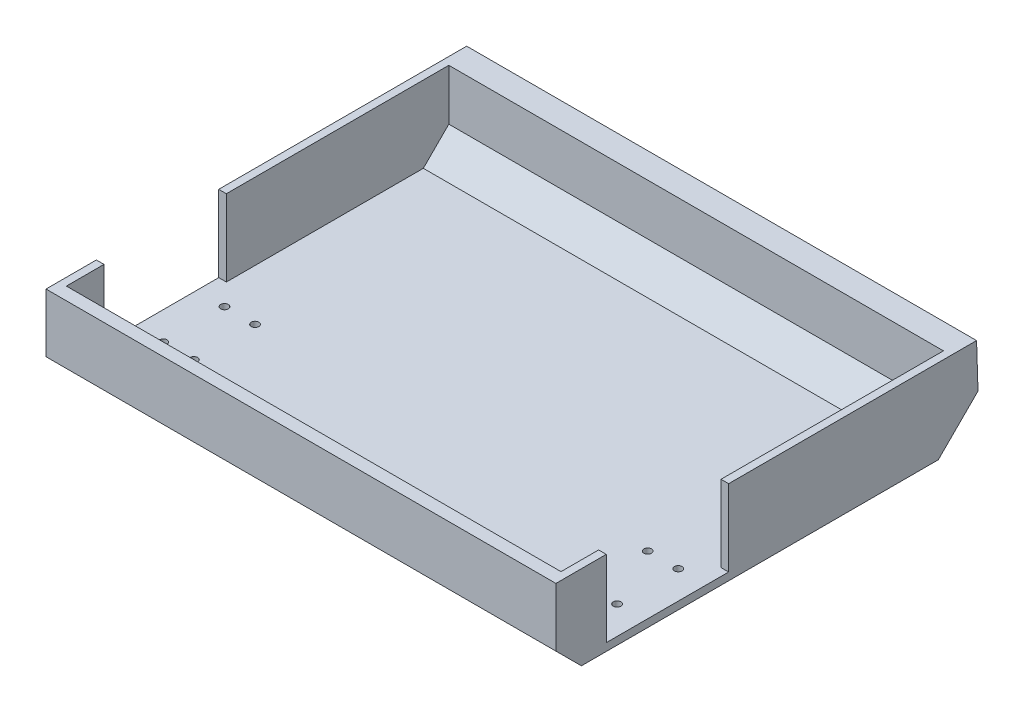
ISO-10303-21;
HEADER;
FILE_DESCRIPTION(('STEP AP214'),'2;1');
FILE_NAME('part.step','',(''),(''),'','','');
FILE_SCHEMA(('AUTOMOTIVE_DESIGN { 1 0 10303 214 1 1 1 1 }'));
ENDSEC;
DATA;
#1=APPLICATION_CONTEXT('core data for automotive mechanical design processes');
#2=APPLICATION_PROTOCOL_DEFINITION('international standard','automotive_design',2000,#1);
#3=PRODUCT_CONTEXT('',#1,'mechanical');
#4=PRODUCT('Part','Part','',(#3));
#5=PRODUCT_RELATED_PRODUCT_CATEGORY('part','',(#4));
#6=PRODUCT_DEFINITION_FORMATION('','',#4);
#7=PRODUCT_DEFINITION_CONTEXT('part definition',#1,'design');
#8=PRODUCT_DEFINITION('design','',#6,#7);
#9=PRODUCT_DEFINITION_SHAPE('','',#8);
#10=(LENGTH_UNIT() NAMED_UNIT(*) SI_UNIT(.MILLI.,.METRE.));
#11=(NAMED_UNIT(*) PLANE_ANGLE_UNIT() SI_UNIT($,.RADIAN.));
#12=(NAMED_UNIT(*) SI_UNIT($,.STERADIAN.) SOLID_ANGLE_UNIT());
#13=UNCERTAINTY_MEASURE_WITH_UNIT(LENGTH_MEASURE(1.E-05),#10,'distance_accuracy_value','');
#14=(GEOMETRIC_REPRESENTATION_CONTEXT(3) GLOBAL_UNCERTAINTY_ASSIGNED_CONTEXT((#13)) GLOBAL_UNIT_ASSIGNED_CONTEXT((#10,
#11,#12)) REPRESENTATION_CONTEXT('',''));
#15=CARTESIAN_POINT('',(0.,0.,0.));
#16=DIRECTION('',(0.,0.,1.));
#17=DIRECTION('',(1.,0.,0.));
#18=AXIS2_PLACEMENT_3D('',#15,#16,#17);
#19=CARTESIAN_POINT('',(2.99999999999999,33.,-150.));
#20=DIRECTION('',(-1.,0.,0.));
#21=DIRECTION('',(0.,0.,1.));
#22=AXIS2_PLACEMENT_3D('',#19,#20,#21);
#23=PLANE('',#22);
#24=DIRECTION('',(0.,0.,-1.));
#25=VECTOR('',#24,1.);
#26=CARTESIAN_POINT('',(2.99999999999999,33.,-150.));
#27=LINE('',#26,#25);
#28=CARTESIAN_POINT('',(3.00000000000001,33.,-62.75));
#29=VERTEX_POINT('',#28);
#30=CARTESIAN_POINT('',(3.,33.,-150.));
#31=VERTEX_POINT('',#30);
#32=EDGE_CURVE('E302',#29,#31,#27,.T.);
#33=ORIENTED_EDGE('',*,*,#32,.F.);
#34=DIRECTION('',(0.,-1.,0.));
#35=VECTOR('',#34,1.);
#36=CARTESIAN_POINT('',(3.00000000000001,33.,-62.75));
#37=LINE('',#36,#35);
#38=CARTESIAN_POINT('',(3.00000000000001,3.,-62.75));
#39=VERTEX_POINT('',#38);
#40=EDGE_CURVE('E239',#29,#39,#37,.T.);
#41=ORIENTED_EDGE('',*,*,#40,.T.);
#42=DIRECTION('',(0.,0.,-1.));
#43=VECTOR('',#42,1.);
#44=CARTESIAN_POINT('',(2.99999999999999,3.,-150.));
#45=LINE('',#44,#43);
#46=CARTESIAN_POINT('',(3.,3.,-140.));
#47=VERTEX_POINT('',#46);
#48=EDGE_CURVE('E300',#39,#47,#45,.T.);
#49=ORIENTED_EDGE('',*,*,#48,.T.);
#50=DIRECTION('',(0.,0.707106781186545,-0.70710678118655));
#51=VECTOR('',#50,1.);
#52=CARTESIAN_POINT('',(3.,3.,-140.));
#53=LINE('',#52,#51);
#54=CARTESIAN_POINT('',(2.99999999999999,13.,-150.));
#55=VERTEX_POINT('',#54);
#56=EDGE_CURVE('E339',#47,#55,#53,.T.);
#57=ORIENTED_EDGE('',*,*,#56,.T.);
#58=DIRECTION('',(0.,-1.,0.));
#59=VECTOR('',#58,1.);
#60=CARTESIAN_POINT('',(2.99999999999999,33.,-150.));
#61=LINE('',#60,#59);
#62=EDGE_CURVE('E307',#31,#55,#61,.T.);
#63=ORIENTED_EDGE('',*,*,#62,.F.);
#64=EDGE_LOOP('',(#33,#41,#49,#57,#63));
#65=FACE_BOUND('',#64,.T.);
#66=ADVANCED_FACE('F41',(#65),#23,.F.);
#67=CARTESIAN_POINT('',(0.,33.,0.));
#68=DIRECTION('',(0.,1.,0.));
#69=DIRECTION('',(0.,0.,1.));
#70=AXIS2_PLACEMENT_3D('',#67,#68,#69);
#71=PLANE('',#70);
#72=DIRECTION('',(1.,0.,0.));
#73=VECTOR('',#72,1.);
#74=CARTESIAN_POINT('',(0.,33.,-62.75));
#75=LINE('',#74,#73);
#76=CARTESIAN_POINT('',(197.,33.,-62.75));
#77=VERTEX_POINT('',#76);
#78=CARTESIAN_POINT('',(200.,33.,-62.75));
#79=VERTEX_POINT('',#78);
#80=EDGE_CURVE('E228',#77,#79,#75,.T.);
#81=ORIENTED_EDGE('',*,*,#80,.T.);
#82=DIRECTION('',(0.,0.,-1.));
#83=VECTOR('',#82,1.);
#84=CARTESIAN_POINT('',(200.,33.,-150.));
#85=LINE('',#84,#83);
#86=CARTESIAN_POINT('',(200.,33.,-160.));
#87=VERTEX_POINT('',#86);
#88=EDGE_CURVE('E287',#79,#87,#85,.T.);
#89=ORIENTED_EDGE('',*,*,#88,.T.);
#90=DIRECTION('',(1.,0.,0.));
#91=VECTOR('',#90,1.);
#92=CARTESIAN_POINT('',(0.,33.,-160.));
#93=LINE('',#92,#91);
#94=CARTESIAN_POINT('',(0.,33.,-160.));
#95=VERTEX_POINT('',#94);
#96=EDGE_CURVE('E206',#95,#87,#93,.T.);
#97=ORIENTED_EDGE('',*,*,#96,.F.);
#98=DIRECTION('',(0.,0.,1.));
#99=VECTOR('',#98,1.);
#100=CARTESIAN_POINT('',(0.,33.,-150.));
#101=LINE('',#100,#99);
#102=CARTESIAN_POINT('',(0.,33.,-62.75));
#103=VERTEX_POINT('',#102);
#104=EDGE_CURVE('E198',#95,#103,#101,.T.);
#105=ORIENTED_EDGE('',*,*,#104,.T.);
#106=EDGE_CURVE('E224',#103,#29,#75,.T.);
#107=ORIENTED_EDGE('',*,*,#106,.T.);
#108=ORIENTED_EDGE('',*,*,#32,.T.);
#109=DIRECTION('',(1.,0.,0.));
#110=VECTOR('',#109,1.);
#111=CARTESIAN_POINT('',(200.,33.,-150.));
#112=LINE('',#111,#110);
#113=CARTESIAN_POINT('',(197.,33.,-150.));
#114=VERTEX_POINT('',#113);
#115=EDGE_CURVE('E267',#31,#114,#112,.T.);
#116=ORIENTED_EDGE('',*,*,#115,.T.);
#117=DIRECTION('',(0.,0.,1.));
#118=VECTOR('',#117,1.);
#119=CARTESIAN_POINT('',(197.,33.,-150.));
#120=LINE('',#119,#118);
#121=EDGE_CURVE('E288',#114,#77,#120,.T.);
#122=ORIENTED_EDGE('',*,*,#121,.T.);
#123=EDGE_LOOP('',(#81,#89,#97,#105,#107,#108,#116,#122));
#124=FACE_BOUND('',#123,.T.);
#125=ADVANCED_FACE('F431',(#124),#71,.T.);
#126=CARTESIAN_POINT('',(197.,33.,-150.));
#127=DIRECTION('',(1.,0.,0.));
#128=DIRECTION('',(0.,0.,-1.));
#129=AXIS2_PLACEMENT_3D('',#126,#127,#128);
#130=PLANE('',#129);
#131=DIRECTION('',(0.,0.,1.));
#132=VECTOR('',#131,1.);
#133=CARTESIAN_POINT('',(197.,3.,-150.));
#134=LINE('',#133,#132);
#135=CARTESIAN_POINT('',(197.,3.,-140.));
#136=VERTEX_POINT('',#135);
#137=CARTESIAN_POINT('',(197.,3.,-62.75));
#138=VERTEX_POINT('',#137);
#139=EDGE_CURVE('E292',#136,#138,#134,.T.);
#140=ORIENTED_EDGE('',*,*,#139,.T.);
#141=DIRECTION('',(0.,1.,0.));
#142=VECTOR('',#141,1.);
#143=CARTESIAN_POINT('',(197.,33.,-62.75));
#144=LINE('',#143,#142);
#145=EDGE_CURVE('E11',#138,#77,#144,.T.);
#146=ORIENTED_EDGE('',*,*,#145,.T.);
#147=ORIENTED_EDGE('',*,*,#121,.F.);
#148=DIRECTION('',(0.,-1.,0.));
#149=VECTOR('',#148,1.);
#150=CARTESIAN_POINT('',(197.,33.,-150.));
#151=LINE('',#150,#149);
#152=CARTESIAN_POINT('',(197.,13.,-150.));
#153=VERTEX_POINT('',#152);
#154=EDGE_CURVE('E297',#114,#153,#151,.T.);
#155=ORIENTED_EDGE('',*,*,#154,.T.);
#156=DIRECTION('',(0.,-0.707106781186545,0.70710678118655));
#157=VECTOR('',#156,1.);
#158=CARTESIAN_POINT('',(197.,3.,-140.));
#159=LINE('',#158,#157);
#160=EDGE_CURVE('E345',#153,#136,#159,.T.);
#161=ORIENTED_EDGE('',*,*,#160,.T.);
#162=EDGE_LOOP('',(#140,#146,#147,#155,#161));
#163=FACE_BOUND('',#162,.T.);
#164=ADVANCED_FACE('F417',(#163),#130,.F.);
#165=CARTESIAN_POINT('',(0.,3.,0.));
#166=DIRECTION('',(0.,-1.,0.));
#167=DIRECTION('',(0.,0.,-1.));
#168=AXIS2_PLACEMENT_3D('',#165,#166,#167);
#169=PLANE('',#168);
#170=CARTESIAN_POINT('',(197.,3.,-14.75));
#171=VERTEX_POINT('',#170);
#172=CARTESIAN_POINT('',(197.,3.,-10.0000000000001));
#173=VERTEX_POINT('',#172);
#174=EDGE_CURVE('E280',#171,#173,#134,.T.);
#175=ORIENTED_EDGE('',*,*,#174,.F.);
#176=DIRECTION('',(1.,0.,0.));
#177=VECTOR('',#176,1.);
#178=CARTESIAN_POINT('',(0.,3.,-14.75));
#179=LINE('',#178,#177);
#180=CARTESIAN_POINT('',(200.,3.,-14.75));
#181=VERTEX_POINT('',#180);
#182=EDGE_CURVE('E64',#171,#181,#179,.T.);
#183=ORIENTED_EDGE('',*,*,#182,.T.);
#184=DIRECTION('',(0.,0.,-1.));
#185=VECTOR('',#184,1.);
#186=CARTESIAN_POINT('',(200.,3.,-14.75));
#187=LINE('',#186,#185);
#188=CARTESIAN_POINT('',(200.,3.,-62.75));
#189=VERTEX_POINT('',#188);
#190=EDGE_CURVE('E220',#181,#189,#187,.T.);
#191=ORIENTED_EDGE('',*,*,#190,.T.);
#192=DIRECTION('',(1.,0.,0.));
#193=VECTOR('',#192,1.);
#194=CARTESIAN_POINT('',(0.,3.,-62.75));
#195=LINE('',#194,#193);
#196=EDGE_CURVE('E231',#138,#189,#195,.T.);
#197=ORIENTED_EDGE('',*,*,#196,.F.);
#198=ORIENTED_EDGE('',*,*,#139,.F.);
#199=DIRECTION('',(-1.,0.,0.));
#200=VECTOR('',#199,1.);
#201=CARTESIAN_POINT('',(0.,3.,-140.));
#202=LINE('',#201,#200);
#203=EDGE_CURVE('E334',#136,#47,#202,.T.);
#204=ORIENTED_EDGE('',*,*,#203,.T.);
#205=ORIENTED_EDGE('',*,*,#48,.F.);
#206=CARTESIAN_POINT('',(0.,3.,-62.75));
#207=VERTEX_POINT('',#206);
#208=EDGE_CURVE('E229',#207,#39,#195,.T.);
#209=ORIENTED_EDGE('',*,*,#208,.F.);
#210=DIRECTION('',(0.,0.,-1.));
#211=VECTOR('',#210,1.);
#212=CARTESIAN_POINT('',(0.,3.,-14.75));
#213=LINE('',#212,#211);
#214=CARTESIAN_POINT('',(0.,3.,-14.75));
#215=VERTEX_POINT('',#214);
#216=EDGE_CURVE('E213',#215,#207,#213,.T.);
#217=ORIENTED_EDGE('',*,*,#216,.F.);
#218=CARTESIAN_POINT('',(3.00000000000002,3.,-14.75));
#219=VERTEX_POINT('',#218);
#220=EDGE_CURVE('E232',#215,#219,#179,.T.);
#221=ORIENTED_EDGE('',*,*,#220,.T.);
#222=CARTESIAN_POINT('',(3.00000000000002,3.,-10.0000000000001));
#223=VERTEX_POINT('',#222);
#224=EDGE_CURVE('E308',#223,#219,#45,.T.);
#225=ORIENTED_EDGE('',*,*,#224,.F.);
#226=DIRECTION('',(1.,0.,0.));
#227=VECTOR('',#226,1.);
#228=CARTESIAN_POINT('',(0.,3.,-10.0000000000001));
#229=LINE('',#228,#227);
#230=EDGE_CURVE('E331',#223,#173,#229,.T.);
#231=ORIENTED_EDGE('',*,*,#230,.T.);
#232=EDGE_LOOP('',(#175,#183,#191,#197,#198,#204,#205,#209,#217,#221,#225,#231));
#233=FACE_BOUND('',#232,.T.);
#234=CARTESIAN_POINT('',(23.,3.,-30.));
#235=DIRECTION('',(0.,1.,0.));
#236=DIRECTION('',(0.,0.,1.));
#237=AXIS2_PLACEMENT_3D('',#234,#235,#236);
#238=CIRCLE('',#237,1.5);
#239=CARTESIAN_POINT('',(23.,3.,-28.5));
#240=VERTEX_POINT('',#239);
#241=EDGE_CURVE('E249',#240,#240,#238,.T.);
#242=ORIENTED_EDGE('',*,*,#241,.F.);
#243=EDGE_LOOP('',(#242));
#244=FACE_BOUND('',#243,.T.);
#245=CARTESIAN_POINT('',(177.,3.,-54.));
#246=DIRECTION('',(0.,1.,0.));
#247=DIRECTION('',(0.,0.,1.));
#248=AXIS2_PLACEMENT_3D('',#245,#246,#247);
#249=CIRCLE('',#248,1.5);
#250=CARTESIAN_POINT('',(177.,3.,-52.5));
#251=VERTEX_POINT('',#250);
#252=EDGE_CURVE('E252',#251,#251,#249,.T.);
#253=ORIENTED_EDGE('',*,*,#252,.F.);
#254=EDGE_LOOP('',(#253));
#255=FACE_BOUND('',#254,.T.);
#256=CARTESIAN_POINT('',(189.,3.,-54.));
#257=DIRECTION('',(0.,1.,0.));
#258=DIRECTION('',(0.,0.,1.));
#259=AXIS2_PLACEMENT_3D('',#256,#257,#258);
#260=CIRCLE('',#259,1.5);
#261=CARTESIAN_POINT('',(189.,3.,-52.5));
#262=VERTEX_POINT('',#261);
#263=EDGE_CURVE('E255',#262,#262,#260,.T.);
#264=ORIENTED_EDGE('',*,*,#263,.F.);
#265=EDGE_LOOP('',(#264));
#266=FACE_BOUND('',#265,.T.);
#267=CARTESIAN_POINT('',(177.,3.,-30.));
#268=DIRECTION('',(0.,1.,0.));
#269=DIRECTION('',(0.,0.,1.));
#270=AXIS2_PLACEMENT_3D('',#267,#268,#269);
#271=CIRCLE('',#270,1.5);
#272=CARTESIAN_POINT('',(177.,3.,-28.5));
#273=VERTEX_POINT('',#272);
#274=EDGE_CURVE('E258',#273,#273,#271,.T.);
#275=ORIENTED_EDGE('',*,*,#274,.F.);
#276=EDGE_LOOP('',(#275));
#277=FACE_BOUND('',#276,.T.);
#278=CARTESIAN_POINT('',(11.,3.,-54.));
#279=DIRECTION('',(0.,1.,0.));
#280=DIRECTION('',(0.,0.,1.));
#281=AXIS2_PLACEMENT_3D('',#278,#279,#280);
#282=CIRCLE('',#281,1.5);
#283=CARTESIAN_POINT('',(11.,3.,-52.5));
#284=VERTEX_POINT('',#283);
#285=EDGE_CURVE('E242',#284,#284,#282,.T.);
#286=ORIENTED_EDGE('',*,*,#285,.F.);
#287=EDGE_LOOP('',(#286));
#288=FACE_BOUND('',#287,.T.);
#289=CARTESIAN_POINT('',(23.,3.,-54.));
#290=DIRECTION('',(0.,1.,0.));
#291=DIRECTION('',(0.,0.,1.));
#292=AXIS2_PLACEMENT_3D('',#289,#290,#291);
#293=CIRCLE('',#292,1.5);
#294=CARTESIAN_POINT('',(23.,3.,-52.5));
#295=VERTEX_POINT('',#294);
#296=EDGE_CURVE('E245',#295,#295,#293,.T.);
#297=ORIENTED_EDGE('',*,*,#296,.F.);
#298=EDGE_LOOP('',(#297));
#299=FACE_BOUND('',#298,.T.);
#300=CARTESIAN_POINT('',(11.,3.,-30.));
#301=DIRECTION('',(0.,1.,0.));
#302=DIRECTION('',(0.,0.,1.));
#303=AXIS2_PLACEMENT_3D('',#300,#301,#302);
#304=CIRCLE('',#303,1.5);
#305=CARTESIAN_POINT('',(11.,3.,-28.5));
#306=VERTEX_POINT('',#305);
#307=EDGE_CURVE('E246',#306,#306,#304,.T.);
#308=ORIENTED_EDGE('',*,*,#307,.F.);
#309=EDGE_LOOP('',(#308));
#310=FACE_BOUND('',#309,.T.);
#311=CARTESIAN_POINT('',(189.,3.,-30.));
#312=DIRECTION('',(0.,1.,0.));
#313=DIRECTION('',(0.,0.,1.));
#314=AXIS2_PLACEMENT_3D('',#311,#312,#313);
#315=CIRCLE('',#314,1.5);
#316=CARTESIAN_POINT('',(189.,3.,-28.5));
#317=VERTEX_POINT('',#316);
#318=EDGE_CURVE('E261',#317,#317,#315,.T.);
#319=ORIENTED_EDGE('',*,*,#318,.F.);
#320=EDGE_LOOP('',(#319));
#321=FACE_BOUND('',#320,.T.);
#322=ADVANCED_FACE('F378',(#233,#244,#255,#266,#277,#288,#299,#310,#321),#169,.F.);
#323=CARTESIAN_POINT('',(0.,3.,0.));
#324=DIRECTION('',(1.,0.,0.));
#325=DIRECTION('',(0.,0.,-1.));
#326=AXIS2_PLACEMENT_3D('',#323,#324,#325);
#327=PLANE('',#326);
#328=ORIENTED_EDGE('',*,*,#216,.T.);
#329=DIRECTION('',(0.,1.,0.));
#330=VECTOR('',#329,1.);
#331=CARTESIAN_POINT('',(0.,3.,-62.75));
#332=LINE('',#331,#330);
#333=EDGE_CURVE('E216',#207,#103,#332,.T.);
#334=ORIENTED_EDGE('',*,*,#333,.T.);
#335=ORIENTED_EDGE('',*,*,#104,.F.);
#336=DIRECTION('',(0.,-0.999484387947177,-0.0321085385817789));
#337=VECTOR('',#336,1.);
#338=CARTESIAN_POINT('',(0.,5.16873890741131,-160.894082120088));
#339=LINE('',#338,#337);
#340=CARTESIAN_POINT('',(0.,15.5602536423128,-160.560253642313));
#341=VERTEX_POINT('',#340);
#342=EDGE_CURVE('E193',#95,#341,#339,.T.);
#343=ORIENTED_EDGE('',*,*,#342,.T.);
#344=DIRECTION('',(0.,-0.707106781186546,0.707106781186549));
#345=VECTOR('',#344,1.);
#346=CARTESIAN_POINT('',(0.,9.99999999999993,-155.));
#347=LINE('',#346,#345);
#348=CARTESIAN_POINT('',(0.,0.,-145.));
#349=VERTEX_POINT('',#348);
#350=EDGE_CURVE('E178',#341,#349,#347,.T.);
#351=ORIENTED_EDGE('',*,*,#350,.T.);
#352=DIRECTION('',(0.,0.,1.));
#353=VECTOR('',#352,1.);
#354=CARTESIAN_POINT('',(0.,0.,0.));
#355=LINE('',#354,#353);
#356=CARTESIAN_POINT('',(0.,0.,-4.99999999999998));
#357=VERTEX_POINT('',#356);
#358=EDGE_CURVE('E316',#349,#357,#355,.T.);
#359=ORIENTED_EDGE('',*,*,#358,.T.);
#360=DIRECTION('',(0.,0.707106781186546,0.707106781186549));
#361=VECTOR('',#360,1.);
#362=CARTESIAN_POINT('',(0.,9.99999999999993,5.));
#363=LINE('',#362,#361);
#364=CARTESIAN_POINT('',(0.,9.99999999999993,5.));
#365=VERTEX_POINT('',#364);
#366=EDGE_CURVE('E190',#357,#365,#363,.T.);
#367=ORIENTED_EDGE('',*,*,#366,.T.);
#368=DIRECTION('',(0.,-1.,0.));
#369=VECTOR('',#368,1.);
#370=CARTESIAN_POINT('',(0.,0.,5.));
#371=LINE('',#370,#369);
#372=CARTESIAN_POINT('',(0.,33.,5.));
#373=VERTEX_POINT('',#372);
#374=EDGE_CURVE('E272',#373,#365,#371,.T.);
#375=ORIENTED_EDGE('',*,*,#374,.F.);
#376=CARTESIAN_POINT('',(0.,33.,-14.75));
#377=VERTEX_POINT('',#376);
#378=EDGE_CURVE('E303',#377,#373,#101,.T.);
#379=ORIENTED_EDGE('',*,*,#378,.F.);
#380=DIRECTION('',(0.,-1.,0.));
#381=VECTOR('',#380,1.);
#382=CARTESIAN_POINT('',(0.,33.,-14.75));
#383=LINE('',#382,#381);
#384=EDGE_CURVE('E56',#377,#215,#383,.T.);
#385=ORIENTED_EDGE('',*,*,#384,.T.);
#386=EDGE_LOOP('',(#328,#334,#335,#343,#351,#359,#367,#375,#379,#385));
#387=FACE_BOUND('',#386,.T.);
#388=ADVANCED_FACE('F195',(#387),#327,.F.);
#389=CARTESIAN_POINT('',(200.,3.,0.));
#390=DIRECTION('',(-1.,0.,0.));
#391=DIRECTION('',(0.,0.,1.));
#392=AXIS2_PLACEMENT_3D('',#389,#390,#391);
#393=PLANE('',#392);
#394=ORIENTED_EDGE('',*,*,#88,.F.);
#395=DIRECTION('',(0.,1.,0.));
#396=VECTOR('',#395,1.);
#397=CARTESIAN_POINT('',(200.,3.,-62.75));
#398=LINE('',#397,#396);
#399=EDGE_CURVE('E214',#189,#79,#398,.T.);
#400=ORIENTED_EDGE('',*,*,#399,.F.);
#401=ORIENTED_EDGE('',*,*,#190,.F.);
#402=DIRECTION('',(0.,-1.,0.));
#403=VECTOR('',#402,1.);
#404=CARTESIAN_POINT('',(200.,33.,-14.75));
#405=LINE('',#404,#403);
#406=CARTESIAN_POINT('',(200.,33.,-14.75));
#407=VERTEX_POINT('',#406);
#408=EDGE_CURVE('E208',#407,#181,#405,.T.);
#409=ORIENTED_EDGE('',*,*,#408,.F.);
#410=CARTESIAN_POINT('',(200.,33.,5.));
#411=VERTEX_POINT('',#410);
#412=EDGE_CURVE('E283',#411,#407,#85,.T.);
#413=ORIENTED_EDGE('',*,*,#412,.F.);
#414=DIRECTION('',(0.,1.,0.));
#415=VECTOR('',#414,1.);
#416=CARTESIAN_POINT('',(200.,33.,5.));
#417=LINE('',#416,#415);
#418=CARTESIAN_POINT('',(200.,9.99999999999993,5.));
#419=VERTEX_POINT('',#418);
#420=EDGE_CURVE('E275',#419,#411,#417,.T.);
#421=ORIENTED_EDGE('',*,*,#420,.F.);
#422=DIRECTION('',(0.,-0.707106781186546,-0.707106781186549));
#423=VECTOR('',#422,1.);
#424=CARTESIAN_POINT('',(200.,9.99999999999993,5.));
#425=LINE('',#424,#423);
#426=CARTESIAN_POINT('',(200.,0.,-4.99999999999998));
#427=VERTEX_POINT('',#426);
#428=EDGE_CURVE('E324',#419,#427,#425,.T.);
#429=ORIENTED_EDGE('',*,*,#428,.T.);
#430=DIRECTION('',(0.,0.,-1.));
#431=VECTOR('',#430,1.);
#432=CARTESIAN_POINT('',(200.,0.,0.));
#433=LINE('',#432,#431);
#434=CARTESIAN_POINT('',(200.,0.,-145.));
#435=VERTEX_POINT('',#434);
#436=EDGE_CURVE('E318',#427,#435,#433,.T.);
#437=ORIENTED_EDGE('',*,*,#436,.T.);
#438=DIRECTION('',(0.,0.707106781186546,-0.707106781186549));
#439=VECTOR('',#438,1.);
#440=CARTESIAN_POINT('',(200.,9.99999999999993,-155.));
#441=LINE('',#440,#439);
#442=CARTESIAN_POINT('',(200.,15.5602536423128,-160.560253642313));
#443=VERTEX_POINT('',#442);
#444=EDGE_CURVE('E326',#435,#443,#441,.T.);
#445=ORIENTED_EDGE('',*,*,#444,.T.);
#446=DIRECTION('',(0.,-0.999484387947177,-0.0321085385817789));
#447=VECTOR('',#446,1.);
#448=CARTESIAN_POINT('',(200.,5.16873890741131,-160.894082120088));
#449=LINE('',#448,#447);
#450=EDGE_CURVE('E202',#87,#443,#449,.T.);
#451=ORIENTED_EDGE('',*,*,#450,.F.);
#452=EDGE_LOOP('',(#394,#400,#401,#409,#413,#421,#429,#437,#445,#451));
#453=FACE_BOUND('',#452,.T.);
#454=ADVANCED_FACE('F408',(#453),#393,.F.);
#455=CARTESIAN_POINT('',(0.,0.,0.));
#456=DIRECTION('',(0.,-1.,0.));
#457=DIRECTION('',(0.,0.,-1.));
#458=AXIS2_PLACEMENT_3D('',#455,#456,#457);
#459=PLANE('',#458);
#460=CARTESIAN_POINT('',(23.,0.,-30.));
#461=DIRECTION('',(0.,-1.,0.));
#462=DIRECTION('',(0.,0.,-1.));
#463=AXIS2_PLACEMENT_3D('',#460,#461,#462);
#464=CIRCLE('',#463,1.5);
#465=CARTESIAN_POINT('',(23.,0.,-31.5));
#466=VERTEX_POINT('',#465);
#467=EDGE_CURVE('E271',#466,#466,#464,.T.);
#468=ORIENTED_EDGE('',*,*,#467,.F.);
#469=EDGE_LOOP('',(#468));
#470=FACE_BOUND('',#469,.T.);
#471=CARTESIAN_POINT('',(177.,0.,-54.));
#472=DIRECTION('',(0.,-1.,0.));
#473=DIRECTION('',(0.,0.,-1.));
#474=AXIS2_PLACEMENT_3D('',#471,#472,#473);
#475=CIRCLE('',#474,1.5);
#476=CARTESIAN_POINT('',(177.,0.,-55.5));
#477=VERTEX_POINT('',#476);
#478=EDGE_CURVE('E366',#477,#477,#475,.T.);
#479=ORIENTED_EDGE('',*,*,#478,.F.);
#480=EDGE_LOOP('',(#479));
#481=FACE_BOUND('',#480,.T.);
#482=CARTESIAN_POINT('',(189.,0.,-54.));
#483=DIRECTION('',(0.,-1.,0.));
#484=DIRECTION('',(0.,0.,-1.));
#485=AXIS2_PLACEMENT_3D('',#482,#483,#484);
#486=CIRCLE('',#485,1.5);
#487=CARTESIAN_POINT('',(189.,0.,-55.5));
#488=VERTEX_POINT('',#487);
#489=EDGE_CURVE('E363',#488,#488,#486,.T.);
#490=ORIENTED_EDGE('',*,*,#489,.F.);
#491=EDGE_LOOP('',(#490));
#492=FACE_BOUND('',#491,.T.);
#493=CARTESIAN_POINT('',(177.,0.,-30.));
#494=DIRECTION('',(0.,-1.,0.));
#495=DIRECTION('',(0.,0.,-1.));
#496=AXIS2_PLACEMENT_3D('',#493,#494,#495);
#497=CIRCLE('',#496,1.5);
#498=CARTESIAN_POINT('',(177.,0.,-31.5));
#499=VERTEX_POINT('',#498);
#500=EDGE_CURVE('E360',#499,#499,#497,.T.);
#501=ORIENTED_EDGE('',*,*,#500,.F.);
#502=EDGE_LOOP('',(#501));
#503=FACE_BOUND('',#502,.T.);
#504=CARTESIAN_POINT('',(11.,0.,-54.));
#505=DIRECTION('',(0.,-1.,0.));
#506=DIRECTION('',(0.,0.,-1.));
#507=AXIS2_PLACEMENT_3D('',#504,#505,#506);
#508=CIRCLE('',#507,1.5);
#509=CARTESIAN_POINT('',(11.,0.,-55.5));
#510=VERTEX_POINT('',#509);
#511=EDGE_CURVE('E357',#510,#510,#508,.T.);
#512=ORIENTED_EDGE('',*,*,#511,.F.);
#513=EDGE_LOOP('',(#512));
#514=FACE_BOUND('',#513,.T.);
#515=CARTESIAN_POINT('',(23.,0.,-54.));
#516=DIRECTION('',(0.,-1.,0.));
#517=DIRECTION('',(0.,0.,-1.));
#518=AXIS2_PLACEMENT_3D('',#515,#516,#517);
#519=CIRCLE('',#518,1.5);
#520=CARTESIAN_POINT('',(23.,0.,-55.5));
#521=VERTEX_POINT('',#520);
#522=EDGE_CURVE('E354',#521,#521,#519,.T.);
#523=ORIENTED_EDGE('',*,*,#522,.F.);
#524=EDGE_LOOP('',(#523));
#525=FACE_BOUND('',#524,.T.);
#526=CARTESIAN_POINT('',(11.,0.,-30.));
#527=DIRECTION('',(0.,-1.,0.));
#528=DIRECTION('',(0.,0.,-1.));
#529=AXIS2_PLACEMENT_3D('',#526,#527,#528);
#530=CIRCLE('',#529,1.5);
#531=CARTESIAN_POINT('',(11.,0.,-31.5));
#532=VERTEX_POINT('',#531);
#533=EDGE_CURVE('E351',#532,#532,#530,.T.);
#534=ORIENTED_EDGE('',*,*,#533,.F.);
#535=EDGE_LOOP('',(#534));
#536=FACE_BOUND('',#535,.T.);
#537=CARTESIAN_POINT('',(189.,0.,-30.));
#538=DIRECTION('',(0.,-1.,0.));
#539=DIRECTION('',(0.,0.,-1.));
#540=AXIS2_PLACEMENT_3D('',#537,#538,#539);
#541=CIRCLE('',#540,1.5);
#542=CARTESIAN_POINT('',(189.,0.,-31.5));
#543=VERTEX_POINT('',#542);
#544=EDGE_CURVE('E266',#543,#543,#541,.T.);
#545=ORIENTED_EDGE('',*,*,#544,.F.);
#546=EDGE_LOOP('',(#545));
#547=FACE_BOUND('',#546,.T.);
#548=ORIENTED_EDGE('',*,*,#358,.F.);
#549=DIRECTION('',(1.,0.,0.));
#550=VECTOR('',#549,1.);
#551=CARTESIAN_POINT('',(200.,0.,-145.));
#552=LINE('',#551,#550);
#553=EDGE_CURVE('E185',#349,#435,#552,.T.);
#554=ORIENTED_EDGE('',*,*,#553,.T.);
#555=ORIENTED_EDGE('',*,*,#436,.F.);
#556=DIRECTION('',(-1.,0.,0.));
#557=VECTOR('',#556,1.);
#558=CARTESIAN_POINT('',(0.,0.,-4.99999999999998));
#559=LINE('',#558,#557);
#560=EDGE_CURVE('E189',#427,#357,#559,.T.);
#561=ORIENTED_EDGE('',*,*,#560,.T.);
#562=EDGE_LOOP('',(#548,#554,#555,#561));
#563=FACE_BOUND('',#562,.T.);
#564=ADVANCED_FACE('F436',(#470,#481,#492,#503,#514,#525,#536,#547,#563),#459,.T.);
#565=ORIENTED_EDGE('',*,*,#224,.T.);
#566=DIRECTION('',(0.,1.,0.));
#567=VECTOR('',#566,1.);
#568=CARTESIAN_POINT('',(3.00000000000002,33.,-14.75));
#569=LINE('',#568,#567);
#570=CARTESIAN_POINT('',(3.00000000000001,33.,-14.75));
#571=VERTEX_POINT('',#570);
#572=EDGE_CURVE('E227',#219,#571,#569,.T.);
#573=ORIENTED_EDGE('',*,*,#572,.T.);
#574=CARTESIAN_POINT('',(3.00000000000001,33.,0.));
#575=VERTEX_POINT('',#574);
#576=EDGE_CURVE('E304',#575,#571,#27,.T.);
#577=ORIENTED_EDGE('',*,*,#576,.F.);
#578=DIRECTION('',(0.,-1.,0.));
#579=VECTOR('',#578,1.);
#580=CARTESIAN_POINT('',(3.00000000000002,33.,0.));
#581=LINE('',#580,#579);
#582=CARTESIAN_POINT('',(3.00000000000002,13.,0.));
#583=VERTEX_POINT('',#582);
#584=EDGE_CURVE('E313',#575,#583,#581,.T.);
#585=ORIENTED_EDGE('',*,*,#584,.T.);
#586=DIRECTION('',(0.,-0.707106781186544,-0.707106781186551));
#587=VECTOR('',#586,1.);
#588=CARTESIAN_POINT('',(3.00000000000002,3.,-10.0000000000001));
#589=LINE('',#588,#587);
#590=EDGE_CURVE('E337',#583,#223,#589,.T.);
#591=ORIENTED_EDGE('',*,*,#590,.T.);
#592=EDGE_LOOP('',(#565,#573,#577,#585,#591));
#593=FACE_BOUND('',#592,.T.);
#594=ADVANCED_FACE('F392',(#593),#23,.F.);
#595=DIRECTION('',(1.,0.,0.));
#596=VECTOR('',#595,1.);
#597=CARTESIAN_POINT('',(0.,33.,-14.75));
#598=LINE('',#597,#596);
#599=EDGE_CURVE('E235',#377,#571,#598,.T.);
#600=ORIENTED_EDGE('',*,*,#599,.F.);
#601=ORIENTED_EDGE('',*,*,#378,.T.);
#602=DIRECTION('',(-1.,0.,0.));
#603=VECTOR('',#602,1.);
#604=CARTESIAN_POINT('',(3.00000000000002,33.,5.));
#605=LINE('',#604,#603);
#606=EDGE_CURVE('E277',#411,#373,#605,.T.);
#607=ORIENTED_EDGE('',*,*,#606,.F.);
#608=ORIENTED_EDGE('',*,*,#412,.T.);
#609=CARTESIAN_POINT('',(197.,33.,-14.75));
#610=VERTEX_POINT('',#609);
#611=EDGE_CURVE('E218',#610,#407,#598,.T.);
#612=ORIENTED_EDGE('',*,*,#611,.F.);
#613=CARTESIAN_POINT('',(197.,33.,0.));
#614=VERTEX_POINT('',#613);
#615=EDGE_CURVE('E286',#610,#614,#120,.T.);
#616=ORIENTED_EDGE('',*,*,#615,.T.);
#617=DIRECTION('',(-1.,0.,0.));
#618=VECTOR('',#617,1.);
#619=CARTESIAN_POINT('',(0.,33.,0.));
#620=LINE('',#619,#618);
#621=EDGE_CURVE('E270',#614,#575,#620,.T.);
#622=ORIENTED_EDGE('',*,*,#621,.T.);
#623=ORIENTED_EDGE('',*,*,#576,.T.);
#624=EDGE_LOOP('',(#600,#601,#607,#608,#612,#616,#622,#623));
#625=FACE_BOUND('',#624,.T.);
#626=ADVANCED_FACE('F390',(#625),#71,.T.);
#627=ORIENTED_EDGE('',*,*,#615,.F.);
#628=DIRECTION('',(0.,-1.,0.));
#629=VECTOR('',#628,1.);
#630=CARTESIAN_POINT('',(197.,33.,-14.75));
#631=LINE('',#630,#629);
#632=EDGE_CURVE('E49',#610,#171,#631,.T.);
#633=ORIENTED_EDGE('',*,*,#632,.T.);
#634=ORIENTED_EDGE('',*,*,#174,.T.);
#635=DIRECTION('',(0.,0.707106781186544,0.707106781186551));
#636=VECTOR('',#635,1.);
#637=CARTESIAN_POINT('',(197.,3.,-10.0000000000001));
#638=LINE('',#637,#636);
#639=CARTESIAN_POINT('',(197.,13.,0.));
#640=VERTEX_POINT('',#639);
#641=EDGE_CURVE('E343',#173,#640,#638,.T.);
#642=ORIENTED_EDGE('',*,*,#641,.T.);
#643=DIRECTION('',(0.,-1.,0.));
#644=VECTOR('',#643,1.);
#645=CARTESIAN_POINT('',(197.,33.,0.));
#646=LINE('',#645,#644);
#647=EDGE_CURVE('E291',#614,#640,#646,.T.);
#648=ORIENTED_EDGE('',*,*,#647,.F.);
#649=EDGE_LOOP('',(#627,#633,#634,#642,#648));
#650=FACE_BOUND('',#649,.T.);
#651=ADVANCED_FACE('F373',(#650),#130,.F.);
#652=CARTESIAN_POINT('',(0.,0.,5.));
#653=DIRECTION('',(0.,0.,-1.));
#654=DIRECTION('',(-1.,0.,0.));
#655=AXIS2_PLACEMENT_3D('',#652,#653,#654);
#656=PLANE('',#655);
#657=ORIENTED_EDGE('',*,*,#374,.T.);
#658=DIRECTION('',(1.,0.,0.));
#659=VECTOR('',#658,1.);
#660=CARTESIAN_POINT('',(200.,9.99999999999993,5.));
#661=LINE('',#660,#659);
#662=EDGE_CURVE('E328',#365,#419,#661,.T.);
#663=ORIENTED_EDGE('',*,*,#662,.T.);
#664=ORIENTED_EDGE('',*,*,#420,.T.);
#665=ORIENTED_EDGE('',*,*,#606,.T.);
#666=EDGE_LOOP('',(#657,#663,#664,#665));
#667=FACE_BOUND('',#666,.T.);
#668=ADVANCED_FACE('F401',(#667),#656,.F.);
#669=CARTESIAN_POINT('',(0.,0.,0.));
#670=DIRECTION('',(0.,0.,-1.));
#671=DIRECTION('',(-1.,0.,0.));
#672=AXIS2_PLACEMENT_3D('',#669,#670,#671);
#673=PLANE('',#672);
#674=ORIENTED_EDGE('',*,*,#647,.T.);
#675=DIRECTION('',(-1.,0.,0.));
#676=VECTOR('',#675,1.);
#677=CARTESIAN_POINT('',(0.,13.,0.));
#678=LINE('',#677,#676);
#679=EDGE_CURVE('E347',#640,#583,#678,.T.);
#680=ORIENTED_EDGE('',*,*,#679,.T.);
#681=ORIENTED_EDGE('',*,*,#584,.F.);
#682=ORIENTED_EDGE('',*,*,#621,.F.);
#683=EDGE_LOOP('',(#674,#680,#681,#682));
#684=FACE_BOUND('',#683,.T.);
#685=ADVANCED_FACE('F387',(#684),#673,.T.);
#686=CARTESIAN_POINT('',(0.,0.,-150.));
#687=DIRECTION('',(0.,0.,1.));
#688=DIRECTION('',(1.,0.,0.));
#689=AXIS2_PLACEMENT_3D('',#686,#687,#688);
#690=PLANE('',#689);
#691=ORIENTED_EDGE('',*,*,#62,.T.);
#692=DIRECTION('',(1.,0.,0.));
#693=VECTOR('',#692,1.);
#694=CARTESIAN_POINT('',(0.,13.,-150.));
#695=LINE('',#694,#693);
#696=EDGE_CURVE('E341',#55,#153,#695,.T.);
#697=ORIENTED_EDGE('',*,*,#696,.T.);
#698=ORIENTED_EDGE('',*,*,#154,.F.);
#699=ORIENTED_EDGE('',*,*,#115,.F.);
#700=EDGE_LOOP('',(#691,#697,#698,#699));
#701=FACE_BOUND('',#700,.T.);
#702=ADVANCED_FACE('F447',(#701),#690,.T.);
#703=CARTESIAN_POINT('',(0.,9.99999999999993,-155.));
#704=DIRECTION('',(0.,-0.707106781186549,-0.707106781186546));
#705=DIRECTION('',(1.,0.,0.));
#706=AXIS2_PLACEMENT_3D('',#703,#704,#705);
#707=PLANE('',#706);
#708=ORIENTED_EDGE('',*,*,#444,.F.);
#709=ORIENTED_EDGE('',*,*,#553,.F.);
#710=ORIENTED_EDGE('',*,*,#350,.F.);
#711=DIRECTION('',(1.,0.,0.));
#712=VECTOR('',#711,1.);
#713=CARTESIAN_POINT('',(0.,15.5602536423128,-160.560253642313));
#714=LINE('',#713,#712);
#715=EDGE_CURVE('E183',#341,#443,#714,.T.);
#716=ORIENTED_EDGE('',*,*,#715,.T.);
#717=EDGE_LOOP('',(#708,#709,#710,#716));
#718=FACE_BOUND('',#717,.T.);
#719=ADVANCED_FACE('F181',(#718),#707,.T.);
#720=CARTESIAN_POINT('',(0.,9.99999999999993,5.));
#721=DIRECTION('',(0.,-0.707106781186549,0.707106781186546));
#722=DIRECTION('',(-1.,0.,0.));
#723=AXIS2_PLACEMENT_3D('',#720,#721,#722);
#724=PLANE('',#723);
#725=ORIENTED_EDGE('',*,*,#366,.F.);
#726=ORIENTED_EDGE('',*,*,#560,.F.);
#727=ORIENTED_EDGE('',*,*,#428,.F.);
#728=ORIENTED_EDGE('',*,*,#662,.F.);
#729=EDGE_LOOP('',(#725,#726,#727,#728));
#730=FACE_BOUND('',#729,.T.);
#731=ADVANCED_FACE('F439',(#730),#724,.T.);
#732=CARTESIAN_POINT('',(0.,3.,-140.));
#733=DIRECTION('',(0.,-0.707106781186551,-0.707106781186545));
#734=DIRECTION('',(-1.,0.,0.));
#735=AXIS2_PLACEMENT_3D('',#732,#733,#734);
#736=PLANE('',#735);
#737=ORIENTED_EDGE('',*,*,#160,.F.);
#738=ORIENTED_EDGE('',*,*,#696,.F.);
#739=ORIENTED_EDGE('',*,*,#56,.F.);
#740=ORIENTED_EDGE('',*,*,#203,.F.);
#741=EDGE_LOOP('',(#737,#738,#739,#740));
#742=FACE_BOUND('',#741,.T.);
#743=ADVANCED_FACE('F422',(#742),#736,.F.);
#744=CARTESIAN_POINT('',(0.,3.,-10.0000000000001));
#745=DIRECTION('',(0.,-0.707106781186551,0.707106781186543));
#746=DIRECTION('',(1.,0.,0.));
#747=AXIS2_PLACEMENT_3D('',#744,#745,#746);
#748=PLANE('',#747);
#749=ORIENTED_EDGE('',*,*,#590,.F.);
#750=ORIENTED_EDGE('',*,*,#679,.F.);
#751=ORIENTED_EDGE('',*,*,#641,.F.);
#752=ORIENTED_EDGE('',*,*,#230,.F.);
#753=EDGE_LOOP('',(#749,#750,#751,#752));
#754=FACE_BOUND('',#753,.T.);
#755=ADVANCED_FACE('F43',(#754),#748,.F.);
#756=CARTESIAN_POINT('',(189.,-7.,-30.));
#757=DIRECTION('',(0.,1.,0.));
#758=DIRECTION('',(0.,0.,1.));
#759=AXIS2_PLACEMENT_3D('',#756,#757,#758);
#760=CYLINDRICAL_SURFACE('',#759,1.5);
#761=ORIENTED_EDGE('',*,*,#544,.T.);
#762=EDGE_LOOP('',(#761));
#763=FACE_BOUND('',#762,.T.);
#764=ORIENTED_EDGE('',*,*,#318,.T.);
#765=EDGE_LOOP('',(#764));
#766=FACE_BOUND('',#765,.T.);
#767=ADVANCED_FACE('F498',(#763,#766),#760,.F.);
#768=CARTESIAN_POINT('',(11.,-7.,-30.));
#769=DIRECTION('',(0.,1.,0.));
#770=DIRECTION('',(0.,0.,1.));
#771=AXIS2_PLACEMENT_3D('',#768,#769,#770);
#772=CYLINDRICAL_SURFACE('',#771,1.5);
#773=ORIENTED_EDGE('',*,*,#533,.T.);
#774=EDGE_LOOP('',(#773));
#775=FACE_BOUND('',#774,.T.);
#776=ORIENTED_EDGE('',*,*,#307,.T.);
#777=EDGE_LOOP('',(#776));
#778=FACE_BOUND('',#777,.T.);
#779=ADVANCED_FACE('F501',(#775,#778),#772,.F.);
#780=CARTESIAN_POINT('',(23.,-7.,-54.));
#781=DIRECTION('',(0.,1.,0.));
#782=DIRECTION('',(0.,0.,1.));
#783=AXIS2_PLACEMENT_3D('',#780,#781,#782);
#784=CYLINDRICAL_SURFACE('',#783,1.5);
#785=ORIENTED_EDGE('',*,*,#522,.T.);
#786=EDGE_LOOP('',(#785));
#787=FACE_BOUND('',#786,.T.);
#788=ORIENTED_EDGE('',*,*,#296,.T.);
#789=EDGE_LOOP('',(#788));
#790=FACE_BOUND('',#789,.T.);
#791=ADVANCED_FACE('F520',(#787,#790),#784,.F.);
#792=CARTESIAN_POINT('',(11.,-7.,-54.));
#793=DIRECTION('',(0.,1.,0.));
#794=DIRECTION('',(0.,0.,1.));
#795=AXIS2_PLACEMENT_3D('',#792,#793,#794);
#796=CYLINDRICAL_SURFACE('',#795,1.5);
#797=ORIENTED_EDGE('',*,*,#511,.T.);
#798=EDGE_LOOP('',(#797));
#799=FACE_BOUND('',#798,.T.);
#800=ORIENTED_EDGE('',*,*,#285,.T.);
#801=EDGE_LOOP('',(#800));
#802=FACE_BOUND('',#801,.T.);
#803=ADVANCED_FACE('F511',(#799,#802),#796,.F.);
#804=CARTESIAN_POINT('',(177.,-7.,-30.));
#805=DIRECTION('',(0.,1.,0.));
#806=DIRECTION('',(0.,0.,1.));
#807=AXIS2_PLACEMENT_3D('',#804,#805,#806);
#808=CYLINDRICAL_SURFACE('',#807,1.5);
#809=ORIENTED_EDGE('',*,*,#500,.T.);
#810=EDGE_LOOP('',(#809));
#811=FACE_BOUND('',#810,.T.);
#812=ORIENTED_EDGE('',*,*,#274,.T.);
#813=EDGE_LOOP('',(#812));
#814=FACE_BOUND('',#813,.T.);
#815=ADVANCED_FACE('F507',(#811,#814),#808,.F.);
#816=CARTESIAN_POINT('',(189.,-7.,-54.));
#817=DIRECTION('',(0.,1.,0.));
#818=DIRECTION('',(0.,0.,1.));
#819=AXIS2_PLACEMENT_3D('',#816,#817,#818);
#820=CYLINDRICAL_SURFACE('',#819,1.5);
#821=ORIENTED_EDGE('',*,*,#489,.T.);
#822=EDGE_LOOP('',(#821));
#823=FACE_BOUND('',#822,.T.);
#824=ORIENTED_EDGE('',*,*,#263,.T.);
#825=EDGE_LOOP('',(#824));
#826=FACE_BOUND('',#825,.T.);
#827=ADVANCED_FACE('F503',(#823,#826),#820,.F.);
#828=CARTESIAN_POINT('',(177.,-7.,-54.));
#829=DIRECTION('',(0.,1.,0.));
#830=DIRECTION('',(0.,0.,1.));
#831=AXIS2_PLACEMENT_3D('',#828,#829,#830);
#832=CYLINDRICAL_SURFACE('',#831,1.5);
#833=ORIENTED_EDGE('',*,*,#478,.T.);
#834=EDGE_LOOP('',(#833));
#835=FACE_BOUND('',#834,.T.);
#836=ORIENTED_EDGE('',*,*,#252,.T.);
#837=EDGE_LOOP('',(#836));
#838=FACE_BOUND('',#837,.T.);
#839=ADVANCED_FACE('F506',(#835,#838),#832,.F.);
#840=CARTESIAN_POINT('',(23.,-7.,-30.));
#841=DIRECTION('',(0.,1.,0.));
#842=DIRECTION('',(0.,0.,1.));
#843=AXIS2_PLACEMENT_3D('',#840,#841,#842);
#844=CYLINDRICAL_SURFACE('',#843,1.5);
#845=ORIENTED_EDGE('',*,*,#467,.T.);
#846=EDGE_LOOP('',(#845));
#847=FACE_BOUND('',#846,.T.);
#848=ORIENTED_EDGE('',*,*,#241,.T.);
#849=EDGE_LOOP('',(#848));
#850=FACE_BOUND('',#849,.T.);
#851=ADVANCED_FACE('F513',(#847,#850),#844,.F.);
#852=CARTESIAN_POINT('',(0.,33.,-14.75));
#853=DIRECTION('',(0.,0.,1.));
#854=DIRECTION('',(0.,-1.,0.));
#855=AXIS2_PLACEMENT_3D('',#852,#853,#854);
#856=PLANE('',#855);
#857=ORIENTED_EDGE('',*,*,#611,.T.);
#858=ORIENTED_EDGE('',*,*,#408,.T.);
#859=ORIENTED_EDGE('',*,*,#182,.F.);
#860=ORIENTED_EDGE('',*,*,#632,.F.);
#861=EDGE_LOOP('',(#857,#858,#859,#860));
#862=FACE_BOUND('',#861,.T.);
#863=ADVANCED_FACE('F410',(#862),#856,.F.);
#864=CARTESIAN_POINT('',(0.,3.,-62.75));
#865=DIRECTION('',(0.,0.,-1.));
#866=DIRECTION('',(-1.,0.,0.));
#867=AXIS2_PLACEMENT_3D('',#864,#865,#866);
#868=PLANE('',#867);
#869=ORIENTED_EDGE('',*,*,#196,.T.);
#870=ORIENTED_EDGE('',*,*,#399,.T.);
#871=ORIENTED_EDGE('',*,*,#80,.F.);
#872=ORIENTED_EDGE('',*,*,#145,.F.);
#873=EDGE_LOOP('',(#869,#870,#871,#872));
#874=FACE_BOUND('',#873,.T.);
#875=ADVANCED_FACE('F534',(#874),#868,.F.);
#876=ORIENTED_EDGE('',*,*,#106,.F.);
#877=ORIENTED_EDGE('',*,*,#333,.F.);
#878=ORIENTED_EDGE('',*,*,#208,.T.);
#879=ORIENTED_EDGE('',*,*,#40,.F.);
#880=EDGE_LOOP('',(#876,#877,#878,#879));
#881=FACE_BOUND('',#880,.T.);
#882=ADVANCED_FACE('F428',(#881),#868,.F.);
#883=ORIENTED_EDGE('',*,*,#220,.F.);
#884=ORIENTED_EDGE('',*,*,#384,.F.);
#885=ORIENTED_EDGE('',*,*,#599,.T.);
#886=ORIENTED_EDGE('',*,*,#572,.F.);
#887=EDGE_LOOP('',(#883,#884,#885,#886));
#888=FACE_BOUND('',#887,.T.);
#889=ADVANCED_FACE('F393',(#888),#856,.F.);
#890=CARTESIAN_POINT('',(0.,5.16873890741131,-160.894082120088));
#891=DIRECTION('',(0.,-0.0321085385817789,0.999484387947177));
#892=DIRECTION('',(0.,-0.999484387947177,-0.0321085385817789));
#893=AXIS2_PLACEMENT_3D('',#890,#891,#892);
#894=PLANE('',#893);
#895=ORIENTED_EDGE('',*,*,#450,.T.);
#896=ORIENTED_EDGE('',*,*,#715,.F.);
#897=ORIENTED_EDGE('',*,*,#342,.F.);
#898=ORIENTED_EDGE('',*,*,#96,.T.);
#899=EDGE_LOOP('',(#895,#896,#897,#898));
#900=FACE_BOUND('',#899,.T.);
#901=ADVANCED_FACE('F204',(#900),#894,.F.);
#902=CLOSED_SHELL('',(#66,#125,#164,#322,#388,#454,#564,#594,#626,#651,#668,#685,#702,#719,#731,
#743,#755,#767,#779,#791,#803,#815,#827,#839,#851,#863,#875,#882,#889,#901));
#903=MANIFOLD_SOLID_BREP('B2',#902);
#904=ADVANCED_BREP_SHAPE_REPRESENTATION('',(#18,#903),#14);
#905=SHAPE_DEFINITION_REPRESENTATION(#9,#904);
ENDSEC;
END-ISO-10303-21;
